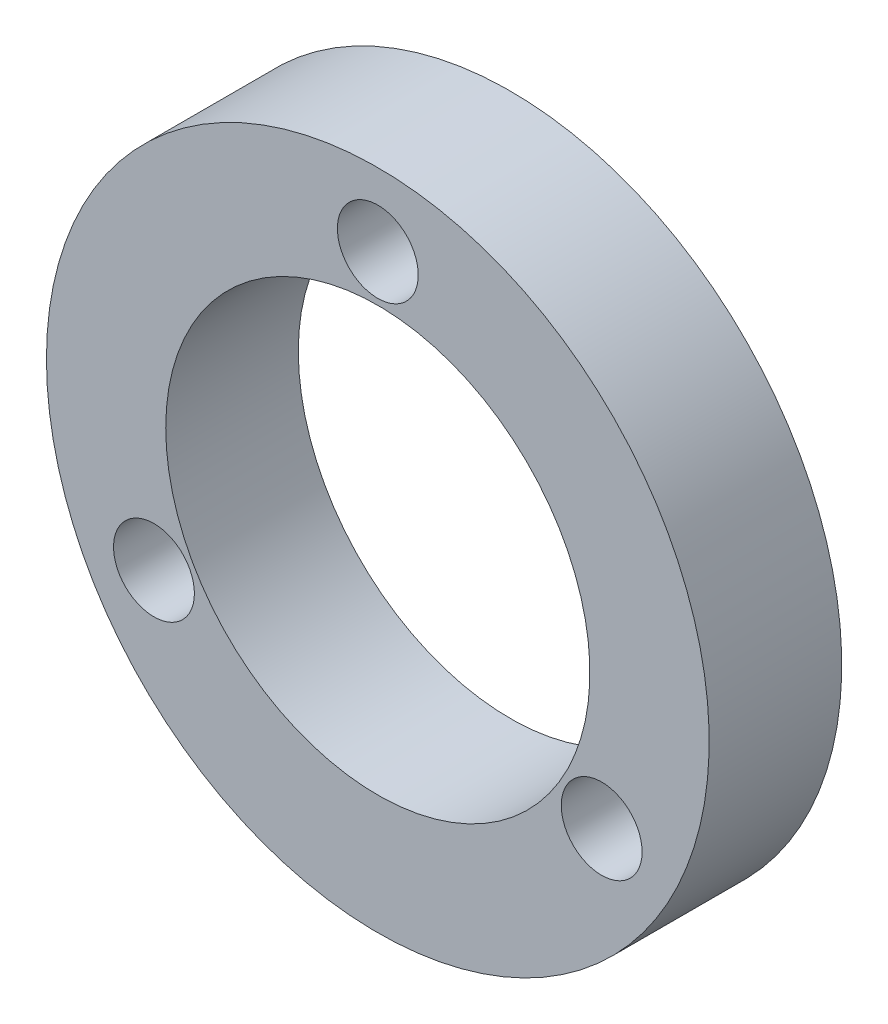
ISO-10303-21;
HEADER;
FILE_DESCRIPTION(('STEP AP214'),'2;1');
FILE_NAME('part.step','',(''),(''),'','','');
FILE_SCHEMA(('AUTOMOTIVE_DESIGN { 1 0 10303 214 1 1 1 1 }'));
ENDSEC;
DATA;
#1=APPLICATION_CONTEXT('core data for automotive mechanical design processes');
#2=APPLICATION_PROTOCOL_DEFINITION('international standard','automotive_design',2000,#1);
#3=PRODUCT_CONTEXT('',#1,'mechanical');
#4=PRODUCT('Part','Part','',(#3));
#5=PRODUCT_RELATED_PRODUCT_CATEGORY('part','',(#4));
#6=PRODUCT_DEFINITION_FORMATION('','',#4);
#7=PRODUCT_DEFINITION_CONTEXT('part definition',#1,'design');
#8=PRODUCT_DEFINITION('design','',#6,#7);
#9=PRODUCT_DEFINITION_SHAPE('','',#8);
#10=(LENGTH_UNIT() NAMED_UNIT(*) SI_UNIT(.MILLI.,.METRE.));
#11=(NAMED_UNIT(*) PLANE_ANGLE_UNIT() SI_UNIT($,.RADIAN.));
#12=(NAMED_UNIT(*) SI_UNIT($,.STERADIAN.) SOLID_ANGLE_UNIT());
#13=UNCERTAINTY_MEASURE_WITH_UNIT(LENGTH_MEASURE(1.E-05),#10,'distance_accuracy_value','');
#14=(GEOMETRIC_REPRESENTATION_CONTEXT(3) GLOBAL_UNCERTAINTY_ASSIGNED_CONTEXT((#13)) GLOBAL_UNIT_ASSIGNED_CONTEXT((#10,
#11,#12)) REPRESENTATION_CONTEXT('',''));
#15=CARTESIAN_POINT('',(0.,0.,0.));
#16=DIRECTION('',(0.,0.,1.));
#17=DIRECTION('',(1.,0.,0.));
#18=AXIS2_PLACEMENT_3D('',#15,#16,#17);
#19=CARTESIAN_POINT('',(2.22044604925031E-13,-1.11022302462516E-13,5.));
#20=DIRECTION('',(0.,0.,1.));
#21=DIRECTION('',(1.,0.,0.));
#22=AXIS2_PLACEMENT_3D('',#19,#20,#21);
#23=PLANE('',#22);
#24=CARTESIAN_POINT('',(1.11022302462516E-13,9.7499999999997,5.));
#25=DIRECTION('',(0.,0.,1.));
#26=DIRECTION('',(1.,0.,0.));
#27=AXIS2_PLACEMENT_3D('',#24,#25,#26);
#28=CIRCLE('',#27,1.525);
#29=CARTESIAN_POINT('',(1.52499999999989,9.74999999999959,5.00000000000001));
#30=VERTEX_POINT('',#29);
#31=EDGE_CURVE('E59',#30,#30,#28,.T.);
#32=ORIENTED_EDGE('',*,*,#31,.F.);
#33=EDGE_LOOP('',(#32));
#34=FACE_BOUND('',#33,.T.);
#35=CARTESIAN_POINT('',(8.44374768689904,-4.87499999999985,5.00000000000012));
#36=DIRECTION('',(0.,0.,1.));
#37=DIRECTION('',(1.,0.,0.));
#38=AXIS2_PLACEMENT_3D('',#35,#36,#37);
#39=CIRCLE('',#38,1.52500000000053);
#40=CARTESIAN_POINT('',(9.96874768689946,-4.87499999999985,5.00000000000012));
#41=VERTEX_POINT('',#40);
#42=EDGE_CURVE('E52',#41,#41,#39,.T.);
#43=ORIENTED_EDGE('',*,*,#42,.F.);
#44=EDGE_LOOP('',(#43));
#45=FACE_BOUND('',#44,.T.);
#46=CARTESIAN_POINT('',(-8.44374768689743,-4.87500000000063,5.00000000000012));
#47=DIRECTION('',(0.,0.,1.));
#48=DIRECTION('',(1.,0.,0.));
#49=AXIS2_PLACEMENT_3D('',#46,#47,#48);
#50=CIRCLE('',#49,1.52500000000079);
#51=CARTESIAN_POINT('',(-6.91874768689681,-4.87500000000052,5.00000000000012));
#52=VERTEX_POINT('',#51);
#53=EDGE_CURVE('E53',#52,#52,#50,.T.);
#54=ORIENTED_EDGE('',*,*,#53,.F.);
#55=EDGE_LOOP('',(#54));
#56=FACE_BOUND('',#55,.T.);
#57=CARTESIAN_POINT('',(2.22044604925031E-13,-1.11022302462516E-13,5.));
#58=DIRECTION('',(0.,0.,1.));
#59=DIRECTION('',(1.,0.,0.));
#60=AXIS2_PLACEMENT_3D('',#57,#58,#59);
#61=CIRCLE('',#60,12.5);
#62=CARTESIAN_POINT('',(-12.4999999999998,-1.11022302462516E-13,5.));
#63=VERTEX_POINT('',#62);
#64=EDGE_CURVE('E10',#63,#63,#61,.T.);
#65=ORIENTED_EDGE('',*,*,#64,.T.);
#66=EDGE_LOOP('',(#65));
#67=FACE_BOUND('',#66,.T.);
#68=CARTESIAN_POINT('',(2.22044604925031E-13,-1.11022302462516E-13,5.));
#69=DIRECTION('',(0.,0.,1.));
#70=DIRECTION('',(1.,0.,0.));
#71=AXIS2_PLACEMENT_3D('',#68,#69,#70);
#72=CIRCLE('',#71,8.);
#73=CARTESIAN_POINT('',(-7.99999999999978,-1.11022302462516E-13,5.));
#74=VERTEX_POINT('',#73);
#75=EDGE_CURVE('E41',#74,#74,#72,.T.);
#76=ORIENTED_EDGE('',*,*,#75,.F.);
#77=EDGE_LOOP('',(#76));
#78=FACE_BOUND('',#77,.T.);
#79=ADVANCED_FACE('F30',(#34,#45,#56,#67,#78),#23,.T.);
#80=CARTESIAN_POINT('',(0.,0.,0.));
#81=DIRECTION('',(0.,0.,1.));
#82=DIRECTION('',(1.,0.,0.));
#83=AXIS2_PLACEMENT_3D('',#80,#81,#82);
#84=PLANE('',#83);
#85=CARTESIAN_POINT('',(-1.11022302462516E-13,9.74999999999959,0.));
#86=DIRECTION('',(0.,0.,1.));
#87=DIRECTION('',(1.,0.,0.));
#88=AXIS2_PLACEMENT_3D('',#85,#86,#87);
#89=CIRCLE('',#88,1.525);
#90=CARTESIAN_POINT('',(1.52499999999989,9.74999999999959,0.));
#91=VERTEX_POINT('',#90);
#92=EDGE_CURVE('E46',#91,#91,#89,.F.);
#93=ORIENTED_EDGE('',*,*,#92,.F.);
#94=EDGE_LOOP('',(#93));
#95=FACE_BOUND('',#94,.T.);
#96=CARTESIAN_POINT('',(8.44374768689893,-4.87499999999985,1.11022302462516E-13));
#97=DIRECTION('',(0.,0.,1.));
#98=DIRECTION('',(1.,0.,0.));
#99=AXIS2_PLACEMENT_3D('',#96,#97,#98);
#100=CIRCLE('',#99,1.52500000000053);
#101=CARTESIAN_POINT('',(9.96874768689946,-4.87499999999985,1.11022302462516E-13));
#102=VERTEX_POINT('',#101);
#103=EDGE_CURVE('E56',#102,#102,#100,.F.);
#104=ORIENTED_EDGE('',*,*,#103,.F.);
#105=EDGE_LOOP('',(#104));
#106=FACE_BOUND('',#105,.T.);
#107=CARTESIAN_POINT('',(-8.44374768689759,-4.87500000000052,1.11022302462516E-13));
#108=DIRECTION('',(0.,0.,1.));
#109=DIRECTION('',(1.,0.,0.));
#110=AXIS2_PLACEMENT_3D('',#107,#108,#109);
#111=CIRCLE('',#110,1.52500000000079);
#112=CARTESIAN_POINT('',(-6.91874768689681,-4.87500000000052,1.11022302462516E-13));
#113=VERTEX_POINT('',#112);
#114=EDGE_CURVE('E49',#113,#113,#111,.F.);
#115=ORIENTED_EDGE('',*,*,#114,.F.);
#116=EDGE_LOOP('',(#115));
#117=FACE_BOUND('',#116,.T.);
#118=CARTESIAN_POINT('',(0.,0.,0.));
#119=DIRECTION('',(0.,0.,1.));
#120=DIRECTION('',(1.,0.,0.));
#121=AXIS2_PLACEMENT_3D('',#118,#119,#120);
#122=CIRCLE('',#121,12.5);
#123=CARTESIAN_POINT('',(-12.4999999999998,-1.11022302462516E-13,0.));
#124=VERTEX_POINT('',#123);
#125=EDGE_CURVE('E34',#124,#124,#122,.T.);
#126=ORIENTED_EDGE('',*,*,#125,.F.);
#127=EDGE_LOOP('',(#126));
#128=FACE_BOUND('',#127,.T.);
#129=CARTESIAN_POINT('',(0.,0.,0.));
#130=DIRECTION('',(0.,0.,1.));
#131=DIRECTION('',(1.,0.,0.));
#132=AXIS2_PLACEMENT_3D('',#129,#130,#131);
#133=CIRCLE('',#132,8.);
#134=CARTESIAN_POINT('',(-7.99999999999978,-1.11022302462516E-13,0.));
#135=VERTEX_POINT('',#134);
#136=EDGE_CURVE('E43',#135,#135,#133,.T.);
#137=ORIENTED_EDGE('',*,*,#136,.T.);
#138=EDGE_LOOP('',(#137));
#139=FACE_BOUND('',#138,.T.);
#140=ADVANCED_FACE('F72',(#95,#106,#117,#128,#139),#84,.F.);
#141=CARTESIAN_POINT('',(2.22044604925031E-13,-1.11022302462516E-13,5.));
#142=DIRECTION('',(0.,0.,-1.));
#143=DIRECTION('',(-1.,0.,0.));
#144=AXIS2_PLACEMENT_3D('',#141,#142,#143);
#145=CYLINDRICAL_SURFACE('',#144,12.5);
#146=CARTESIAN_POINT('',(-12.4999999999998,-1.11022302462516E-13,5.));
#147=CARTESIAN_POINT('',(-12.4999999999998,-1.11022302462516E-13,4.94791666666667));
#148=CARTESIAN_POINT('',(-12.4999999999998,-1.11022302462516E-13,4.89583333333334));
#149=CARTESIAN_POINT('',(-12.4999999999998,-1.11022302462516E-13,4.79166666666667));
#150=CARTESIAN_POINT('',(-12.4999999999998,-1.11022302462516E-13,4.73958333333334));
#151=CARTESIAN_POINT('',(-12.4999999999998,-1.11022302462516E-13,4.63541666666667));
#152=CARTESIAN_POINT('',(-12.4999999999998,-1.11022302462516E-13,4.58333333333334));
#153=CARTESIAN_POINT('',(-12.4999999999998,-1.11022302462516E-13,4.47916666666667));
#154=CARTESIAN_POINT('',(-12.4999999999998,-1.11022302462516E-13,4.42708333333334));
#155=CARTESIAN_POINT('',(-12.4999999999998,-1.11022302462516E-13,4.32291666666667));
#156=CARTESIAN_POINT('',(-12.4999999999998,-1.11022302462516E-13,4.27083333333334));
#157=CARTESIAN_POINT('',(-12.4999999999998,-1.11022302462516E-13,4.16666666666667));
#158=CARTESIAN_POINT('',(-12.4999999999998,-1.11022302462516E-13,4.11458333333334));
#159=CARTESIAN_POINT('',(-12.4999999999998,-1.11022302462516E-13,4.01041666666667));
#160=CARTESIAN_POINT('',(-12.4999999999998,-1.11022302462516E-13,3.95833333333334));
#161=CARTESIAN_POINT('',(-12.4999999999998,-1.11022302462516E-13,3.85416666666667));
#162=CARTESIAN_POINT('',(-12.4999999999998,-1.11022302462516E-13,3.80208333333334));
#163=CARTESIAN_POINT('',(-12.4999999999998,-1.11022302462516E-13,3.69791666666667));
#164=CARTESIAN_POINT('',(-12.4999999999998,-1.11022302462516E-13,3.64583333333334));
#165=CARTESIAN_POINT('',(-12.4999999999998,-1.11022302462516E-13,3.54166666666667));
#166=CARTESIAN_POINT('',(-12.4999999999998,-1.11022302462516E-13,3.48958333333334));
#167=CARTESIAN_POINT('',(-12.4999999999998,-1.11022302462516E-13,3.38541666666667));
#168=CARTESIAN_POINT('',(-12.4999999999998,-1.11022302462516E-13,3.33333333333334));
#169=CARTESIAN_POINT('',(-12.4999999999998,-1.11022302462516E-13,3.22916666666667));
#170=CARTESIAN_POINT('',(-12.4999999999998,-1.11022302462516E-13,3.17708333333334));
#171=CARTESIAN_POINT('',(-12.4999999999998,-1.11022302462516E-13,3.07291666666667));
#172=CARTESIAN_POINT('',(-12.4999999999998,-1.11022302462516E-13,3.02083333333334));
#173=CARTESIAN_POINT('',(-12.4999999999998,-1.11022302462516E-13,2.91666666666667));
#174=CARTESIAN_POINT('',(-12.4999999999998,-1.11022302462516E-13,2.86458333333334));
#175=CARTESIAN_POINT('',(-12.4999999999998,-1.11022302462516E-13,2.76041666666667));
#176=CARTESIAN_POINT('',(-12.4999999999998,-1.11022302462516E-13,2.70833333333333));
#177=CARTESIAN_POINT('',(-12.4999999999998,-1.11022302462516E-13,2.60416666666667));
#178=CARTESIAN_POINT('',(-12.4999999999998,-1.11022302462516E-13,2.55208333333333));
#179=CARTESIAN_POINT('',(-12.4999999999998,-1.11022302462516E-13,2.44791666666667));
#180=CARTESIAN_POINT('',(-12.4999999999998,-1.11022302462516E-13,2.39583333333333));
#181=CARTESIAN_POINT('',(-12.4999999999998,-1.11022302462516E-13,2.29166666666667));
#182=CARTESIAN_POINT('',(-12.4999999999998,-1.11022302462516E-13,2.23958333333333));
#183=CARTESIAN_POINT('',(-12.4999999999998,-1.11022302462516E-13,2.13541666666667));
#184=CARTESIAN_POINT('',(-12.4999999999998,-1.11022302462516E-13,2.08333333333333));
#185=CARTESIAN_POINT('',(-12.4999999999998,-1.11022302462516E-13,1.97916666666667));
#186=CARTESIAN_POINT('',(-12.4999999999998,-1.11022302462516E-13,1.92708333333333));
#187=CARTESIAN_POINT('',(-12.4999999999998,-1.11022302462516E-13,1.82291666666667));
#188=CARTESIAN_POINT('',(-12.4999999999998,-1.11022302462516E-13,1.77083333333333));
#189=CARTESIAN_POINT('',(-12.4999999999998,-1.11022302462516E-13,1.66666666666667));
#190=CARTESIAN_POINT('',(-12.4999999999998,-1.11022302462516E-13,1.61458333333333));
#191=CARTESIAN_POINT('',(-12.4999999999998,-1.11022302462516E-13,1.51041666666667));
#192=CARTESIAN_POINT('',(-12.4999999999998,-1.11022302462516E-13,1.45833333333333));
#193=CARTESIAN_POINT('',(-12.4999999999998,-1.11022302462516E-13,1.35416666666667));
#194=CARTESIAN_POINT('',(-12.4999999999998,-1.11022302462516E-13,1.30208333333333));
#195=CARTESIAN_POINT('',(-12.4999999999998,-1.11022302462516E-13,1.19791666666667));
#196=CARTESIAN_POINT('',(-12.4999999999998,-1.11022302462516E-13,1.14583333333333));
#197=CARTESIAN_POINT('',(-12.4999999999998,-1.11022302462516E-13,1.04166666666667));
#198=CARTESIAN_POINT('',(-12.4999999999998,-1.11022302462516E-13,0.989583333333333));
#199=CARTESIAN_POINT('',(-12.4999999999998,-1.11022302462516E-13,0.885416666666666));
#200=CARTESIAN_POINT('',(-12.4999999999998,-1.11022302462516E-13,0.833333333333333));
#201=CARTESIAN_POINT('',(-12.4999999999998,-1.11022302462516E-13,0.729166666666666));
#202=CARTESIAN_POINT('',(-12.4999999999998,-1.11022302462516E-13,0.677083333333332));
#203=CARTESIAN_POINT('',(-12.4999999999998,-1.11022302462516E-13,0.572916666666666));
#204=CARTESIAN_POINT('',(-12.4999999999998,-1.11022302462516E-13,0.520833333333332));
#205=CARTESIAN_POINT('',(-12.4999999999998,-1.11022302462516E-13,0.416666666666665));
#206=CARTESIAN_POINT('',(-12.4999999999998,-1.11022302462516E-13,0.364583333333332));
#207=CARTESIAN_POINT('',(-12.4999999999998,-1.11022302462516E-13,0.260416666666665));
#208=CARTESIAN_POINT('',(-12.4999999999998,-1.11022302462516E-13,0.208333333333332));
#209=CARTESIAN_POINT('',(-12.4999999999998,-1.11022302462516E-13,0.104166666666665));
#210=CARTESIAN_POINT('',(-12.4999999999998,-1.11022302462516E-13,0.0520833333333322));
#211=CARTESIAN_POINT('',(-12.4999999999998,-1.11022302462516E-13,0.));
#212=B_SPLINE_CURVE_WITH_KNOTS('',3,(#146,#147,#148,#149,#150,#151,#152,#153,#154,#155,#156,
#157,#158,#159,#160,#161,#162,#163,#164,#165,#166,#167,#168,#169,#170,#171,#172,#173,#174,#175,
#176,#177,#178,#179,#180,#181,#182,#183,#184,#185,#186,#187,#188,#189,#190,#191,#192,#193,#194,
#195,#196,#197,#198,#199,#200,#201,#202,#203,#204,#205,#206,#207,#208,#209,#210,#211),
.UNSPECIFIED.,.F.,.F.,(4,2,2,2,2,2,2,2,2,2,2,2,2,2,2,2,2,2,2,2,2,2,2,2,2,2,2,2,2,2,2,2,4),(0.,
0.156249999999999,0.312499999999999,0.46875,0.625,0.781250000000001,0.9375,1.09375,1.25,1.40625,
1.5625,1.71875,1.875,2.03125,2.1875,2.34375,2.5,2.65625,2.8125,2.96875,3.125,3.28125,3.4375,
3.59375,3.75,3.90625,4.0625,4.21875,4.375,4.53125000000001,4.68750000000001,4.84375000000001,
5.),.UNSPECIFIED.);
#213=EDGE_CURVE('BSEAM32',#63,#124,#212,.T.);
#214=ORIENTED_EDGE('',*,*,#64,.F.);
#215=ORIENTED_EDGE('',*,*,#125,.T.);
#216=ORIENTED_EDGE('',*,*,#213,.T.);
#217=ORIENTED_EDGE('',*,*,#213,.F.);
#218=EDGE_LOOP('',(#214,#216,#215,#217));
#219=FACE_BOUND('',#218,.T.);
#220=ADVANCED_FACE('F32',(#219),#145,.T.);
#221=CARTESIAN_POINT('',(2.22044604925031E-13,-1.11022302462516E-13,5.));
#222=DIRECTION('',(0.,0.,-1.));
#223=DIRECTION('',(-1.,0.,0.));
#224=AXIS2_PLACEMENT_3D('',#221,#222,#223);
#225=CYLINDRICAL_SURFACE('',#224,8.);
#226=CARTESIAN_POINT('',(-7.99999999999978,-1.11022302462516E-13,5.));
#227=CARTESIAN_POINT('',(-7.99999999999978,-1.11022302462516E-13,4.94791666666667));
#228=CARTESIAN_POINT('',(-7.99999999999978,-1.11022302462516E-13,4.89583333333334));
#229=CARTESIAN_POINT('',(-7.99999999999978,-1.11022302462516E-13,4.79166666666667));
#230=CARTESIAN_POINT('',(-7.99999999999978,-1.11022302462516E-13,4.73958333333334));
#231=CARTESIAN_POINT('',(-7.99999999999978,-1.11022302462516E-13,4.63541666666667));
#232=CARTESIAN_POINT('',(-7.99999999999978,-1.11022302462516E-13,4.58333333333334));
#233=CARTESIAN_POINT('',(-7.99999999999978,-1.11022302462516E-13,4.47916666666667));
#234=CARTESIAN_POINT('',(-7.99999999999978,-1.11022302462516E-13,4.42708333333334));
#235=CARTESIAN_POINT('',(-7.99999999999978,-1.11022302462516E-13,4.32291666666667));
#236=CARTESIAN_POINT('',(-7.99999999999978,-1.11022302462516E-13,4.27083333333334));
#237=CARTESIAN_POINT('',(-7.99999999999978,-1.11022302462516E-13,4.16666666666667));
#238=CARTESIAN_POINT('',(-7.99999999999978,-1.11022302462516E-13,4.11458333333334));
#239=CARTESIAN_POINT('',(-7.99999999999978,-1.11022302462516E-13,4.01041666666667));
#240=CARTESIAN_POINT('',(-7.99999999999978,-1.11022302462516E-13,3.95833333333334));
#241=CARTESIAN_POINT('',(-7.99999999999978,-1.11022302462516E-13,3.85416666666667));
#242=CARTESIAN_POINT('',(-7.99999999999978,-1.11022302462516E-13,3.80208333333334));
#243=CARTESIAN_POINT('',(-7.99999999999978,-1.11022302462516E-13,3.69791666666667));
#244=CARTESIAN_POINT('',(-7.99999999999978,-1.11022302462516E-13,3.64583333333334));
#245=CARTESIAN_POINT('',(-7.99999999999978,-1.11022302462516E-13,3.54166666666667));
#246=CARTESIAN_POINT('',(-7.99999999999978,-1.11022302462516E-13,3.48958333333334));
#247=CARTESIAN_POINT('',(-7.99999999999978,-1.11022302462516E-13,3.38541666666667));
#248=CARTESIAN_POINT('',(-7.99999999999978,-1.11022302462516E-13,3.33333333333334));
#249=CARTESIAN_POINT('',(-7.99999999999978,-1.11022302462516E-13,3.22916666666667));
#250=CARTESIAN_POINT('',(-7.99999999999978,-1.11022302462516E-13,3.17708333333334));
#251=CARTESIAN_POINT('',(-7.99999999999978,-1.11022302462516E-13,3.07291666666667));
#252=CARTESIAN_POINT('',(-7.99999999999978,-1.11022302462516E-13,3.02083333333333));
#253=CARTESIAN_POINT('',(-7.99999999999978,-1.11022302462516E-13,2.91666666666667));
#254=CARTESIAN_POINT('',(-7.99999999999978,-1.11022302462516E-13,2.86458333333333));
#255=CARTESIAN_POINT('',(-7.99999999999978,-1.11022302462516E-13,2.76041666666667));
#256=CARTESIAN_POINT('',(-7.99999999999978,-1.11022302462516E-13,2.70833333333333));
#257=CARTESIAN_POINT('',(-7.99999999999978,-1.11022302462516E-13,2.60416666666667));
#258=CARTESIAN_POINT('',(-7.99999999999978,-1.11022302462516E-13,2.55208333333333));
#259=CARTESIAN_POINT('',(-7.99999999999978,-1.11022302462516E-13,2.44791666666667));
#260=CARTESIAN_POINT('',(-7.99999999999978,-1.11022302462516E-13,2.39583333333333));
#261=CARTESIAN_POINT('',(-7.99999999999978,-1.11022302462516E-13,2.29166666666667));
#262=CARTESIAN_POINT('',(-7.99999999999978,-1.11022302462516E-13,2.23958333333333));
#263=CARTESIAN_POINT('',(-7.99999999999978,-1.11022302462516E-13,2.13541666666667));
#264=CARTESIAN_POINT('',(-7.99999999999978,-1.11022302462516E-13,2.08333333333333));
#265=CARTESIAN_POINT('',(-7.99999999999978,-1.11022302462516E-13,1.97916666666667));
#266=CARTESIAN_POINT('',(-7.99999999999978,-1.11022302462516E-13,1.92708333333333));
#267=CARTESIAN_POINT('',(-7.99999999999978,-1.11022302462516E-13,1.82291666666667));
#268=CARTESIAN_POINT('',(-7.99999999999978,-1.11022302462516E-13,1.77083333333333));
#269=CARTESIAN_POINT('',(-7.99999999999978,-1.11022302462516E-13,1.66666666666667));
#270=CARTESIAN_POINT('',(-7.99999999999978,-1.11022302462516E-13,1.61458333333333));
#271=CARTESIAN_POINT('',(-7.99999999999978,-1.11022302462516E-13,1.51041666666667));
#272=CARTESIAN_POINT('',(-7.99999999999978,-1.11022302462516E-13,1.45833333333333));
#273=CARTESIAN_POINT('',(-7.99999999999978,-1.11022302462516E-13,1.35416666666667));
#274=CARTESIAN_POINT('',(-7.99999999999978,-1.11022302462516E-13,1.30208333333333));
#275=CARTESIAN_POINT('',(-7.99999999999978,-1.11022302462516E-13,1.19791666666667));
#276=CARTESIAN_POINT('',(-7.99999999999978,-1.11022302462516E-13,1.14583333333333));
#277=CARTESIAN_POINT('',(-7.99999999999978,-1.11022302462516E-13,1.04166666666667));
#278=CARTESIAN_POINT('',(-7.99999999999978,-1.11022302462516E-13,0.989583333333333));
#279=CARTESIAN_POINT('',(-7.99999999999978,-1.11022302462516E-13,0.885416666666667));
#280=CARTESIAN_POINT('',(-7.99999999999978,-1.11022302462516E-13,0.833333333333333));
#281=CARTESIAN_POINT('',(-7.99999999999978,-1.11022302462516E-13,0.729166666666666));
#282=CARTESIAN_POINT('',(-7.99999999999978,-1.11022302462516E-13,0.677083333333332));
#283=CARTESIAN_POINT('',(-7.99999999999978,-1.11022302462516E-13,0.572916666666666));
#284=CARTESIAN_POINT('',(-7.99999999999978,-1.11022302462516E-13,0.520833333333332));
#285=CARTESIAN_POINT('',(-7.99999999999978,-1.11022302462516E-13,0.416666666666665));
#286=CARTESIAN_POINT('',(-7.99999999999978,-1.11022302462516E-13,0.364583333333332));
#287=CARTESIAN_POINT('',(-7.99999999999978,-1.11022302462516E-13,0.260416666666665));
#288=CARTESIAN_POINT('',(-7.99999999999978,-1.11022302462516E-13,0.208333333333332));
#289=CARTESIAN_POINT('',(-7.99999999999978,-1.11022302462516E-13,0.104166666666665));
#290=CARTESIAN_POINT('',(-7.99999999999978,-1.11022302462516E-13,0.0520833333333322));
#291=CARTESIAN_POINT('',(-7.99999999999978,-1.11022302462516E-13,0.));
#292=B_SPLINE_CURVE_WITH_KNOTS('',3,(#226,#227,#228,#229,#230,#231,#232,#233,#234,#235,#236,
#237,#238,#239,#240,#241,#242,#243,#244,#245,#246,#247,#248,#249,#250,#251,#252,#253,#254,#255,
#256,#257,#258,#259,#260,#261,#262,#263,#264,#265,#266,#267,#268,#269,#270,#271,#272,#273,#274,
#275,#276,#277,#278,#279,#280,#281,#282,#283,#284,#285,#286,#287,#288,#289,#290,#291),
.UNSPECIFIED.,.F.,.F.,(4,2,2,2,2,2,2,2,2,2,2,2,2,2,2,2,2,2,2,2,2,2,2,2,2,2,2,2,2,2,2,2,4),(0.,
0.156250000000001,0.312500000000001,0.468750000000001,0.625000000000001,0.781250000000002,
0.937500000000002,1.09375,1.25,1.40625,1.5625,1.71875,1.875,2.03125,2.1875,2.34375,2.5,2.65625,
2.8125,2.96875,3.125,3.28125,3.4375,3.59375,3.75,3.90625,4.0625,4.21875,4.37500000000001,
4.53125000000001,4.68750000000001,4.84375000000001,5.00000000000001),.UNSPECIFIED.);
#293=EDGE_CURVE('BSEAM80',#74,#135,#292,.T.);
#294=ORIENTED_EDGE('',*,*,#75,.T.);
#295=ORIENTED_EDGE('',*,*,#136,.F.);
#296=ORIENTED_EDGE('',*,*,#293,.T.);
#297=ORIENTED_EDGE('',*,*,#293,.F.);
#298=EDGE_LOOP('',(#294,#296,#295,#297));
#299=FACE_BOUND('',#298,.T.);
#300=ADVANCED_FACE('F80',(#299),#225,.F.);
#301=CARTESIAN_POINT('',(-8.44374768689759,-4.87500000000052,-0.000999999999917733));
#302=DIRECTION('',(0.,0.,1.));
#303=DIRECTION('',(1.,0.,0.));
#304=AXIS2_PLACEMENT_3D('',#301,#302,#303);
#305=CYLINDRICAL_SURFACE('',#304,1.52500000000079);
#306=CARTESIAN_POINT('',(-6.91874768689681,-4.87500000000052,5.00000000000012));
#307=CARTESIAN_POINT('',(-6.91874768689681,-4.87500000000052,4.94791666666678));
#308=CARTESIAN_POINT('',(-6.91874768689681,-4.87500000000052,4.89583333333345));
#309=CARTESIAN_POINT('',(-6.91874768689681,-4.87500000000052,4.79166666666678));
#310=CARTESIAN_POINT('',(-6.91874768689681,-4.87500000000052,4.73958333333345));
#311=CARTESIAN_POINT('',(-6.91874768689681,-4.87500000000052,4.63541666666678));
#312=CARTESIAN_POINT('',(-6.91874768689681,-4.87500000000052,4.58333333333345));
#313=CARTESIAN_POINT('',(-6.91874768689681,-4.87500000000052,4.47916666666678));
#314=CARTESIAN_POINT('',(-6.91874768689681,-4.87500000000052,4.42708333333345));
#315=CARTESIAN_POINT('',(-6.91874768689681,-4.87500000000052,4.32291666666678));
#316=CARTESIAN_POINT('',(-6.91874768689681,-4.87500000000052,4.27083333333345));
#317=CARTESIAN_POINT('',(-6.91874768689681,-4.87500000000052,4.16666666666678));
#318=CARTESIAN_POINT('',(-6.91874768689681,-4.87500000000052,4.11458333333345));
#319=CARTESIAN_POINT('',(-6.91874768689681,-4.87500000000052,4.01041666666678));
#320=CARTESIAN_POINT('',(-6.91874768689681,-4.87500000000052,3.95833333333345));
#321=CARTESIAN_POINT('',(-6.91874768689681,-4.87500000000052,3.85416666666678));
#322=CARTESIAN_POINT('',(-6.91874768689681,-4.87500000000052,3.80208333333345));
#323=CARTESIAN_POINT('',(-6.91874768689681,-4.87500000000052,3.69791666666678));
#324=CARTESIAN_POINT('',(-6.91874768689681,-4.87500000000052,3.64583333333345));
#325=CARTESIAN_POINT('',(-6.91874768689681,-4.87500000000052,3.54166666666678));
#326=CARTESIAN_POINT('',(-6.91874768689681,-4.87500000000052,3.48958333333345));
#327=CARTESIAN_POINT('',(-6.91874768689681,-4.87500000000052,3.38541666666678));
#328=CARTESIAN_POINT('',(-6.91874768689681,-4.87500000000052,3.33333333333345));
#329=CARTESIAN_POINT('',(-6.91874768689681,-4.87500000000052,3.22916666666678));
#330=CARTESIAN_POINT('',(-6.91874768689681,-4.87500000000052,3.17708333333345));
#331=CARTESIAN_POINT('',(-6.91874768689681,-4.87500000000052,3.07291666666678));
#332=CARTESIAN_POINT('',(-6.91874768689681,-4.87500000000052,3.02083333333345));
#333=CARTESIAN_POINT('',(-6.91874768689681,-4.87500000000052,2.91666666666678));
#334=CARTESIAN_POINT('',(-6.91874768689681,-4.87500000000052,2.86458333333345));
#335=CARTESIAN_POINT('',(-6.91874768689681,-4.87500000000052,2.76041666666678));
#336=CARTESIAN_POINT('',(-6.91874768689681,-4.87500000000052,2.70833333333345));
#337=CARTESIAN_POINT('',(-6.91874768689681,-4.87500000000052,2.60416666666678));
#338=CARTESIAN_POINT('',(-6.91874768689681,-4.87500000000052,2.55208333333345));
#339=CARTESIAN_POINT('',(-6.91874768689681,-4.87500000000052,2.44791666666678));
#340=CARTESIAN_POINT('',(-6.91874768689681,-4.87500000000052,2.39583333333345));
#341=CARTESIAN_POINT('',(-6.91874768689681,-4.87500000000052,2.29166666666678));
#342=CARTESIAN_POINT('',(-6.91874768689681,-4.87500000000052,2.23958333333345));
#343=CARTESIAN_POINT('',(-6.91874768689681,-4.87500000000052,2.13541666666678));
#344=CARTESIAN_POINT('',(-6.91874768689681,-4.87500000000052,2.08333333333345));
#345=CARTESIAN_POINT('',(-6.91874768689681,-4.87500000000052,1.97916666666678));
#346=CARTESIAN_POINT('',(-6.91874768689681,-4.87500000000052,1.92708333333345));
#347=CARTESIAN_POINT('',(-6.91874768689681,-4.87500000000052,1.82291666666678));
#348=CARTESIAN_POINT('',(-6.91874768689681,-4.87500000000052,1.77083333333345));
#349=CARTESIAN_POINT('',(-6.91874768689681,-4.87500000000052,1.66666666666678));
#350=CARTESIAN_POINT('',(-6.91874768689681,-4.87500000000052,1.61458333333345));
#351=CARTESIAN_POINT('',(-6.91874768689681,-4.87500000000052,1.51041666666678));
#352=CARTESIAN_POINT('',(-6.91874768689681,-4.87500000000052,1.45833333333345));
#353=CARTESIAN_POINT('',(-6.91874768689681,-4.87500000000052,1.35416666666678));
#354=CARTESIAN_POINT('',(-6.91874768689681,-4.87500000000052,1.30208333333345));
#355=CARTESIAN_POINT('',(-6.91874768689681,-4.87500000000052,1.19791666666678));
#356=CARTESIAN_POINT('',(-6.91874768689681,-4.87500000000052,1.14583333333345));
#357=CARTESIAN_POINT('',(-6.91874768689681,-4.87500000000052,1.04166666666678));
#358=CARTESIAN_POINT('',(-6.91874768689681,-4.87500000000052,0.989583333333446));
#359=CARTESIAN_POINT('',(-6.91874768689681,-4.87500000000052,0.885416666666779));
#360=CARTESIAN_POINT('',(-6.91874768689681,-4.87500000000052,0.833333333333446));
#361=CARTESIAN_POINT('',(-6.91874768689681,-4.87500000000052,0.729166666666779));
#362=CARTESIAN_POINT('',(-6.91874768689681,-4.87500000000052,0.677083333333445));
#363=CARTESIAN_POINT('',(-6.91874768689681,-4.87500000000052,0.572916666666778));
#364=CARTESIAN_POINT('',(-6.91874768689681,-4.87500000000052,0.520833333333445));
#365=CARTESIAN_POINT('',(-6.91874768689681,-4.87500000000052,0.416666666666778));
#366=CARTESIAN_POINT('',(-6.91874768689681,-4.87500000000052,0.364583333333445));
#367=CARTESIAN_POINT('',(-6.91874768689681,-4.87500000000052,0.260416666666778));
#368=CARTESIAN_POINT('',(-6.91874768689681,-4.87500000000052,0.208333333333444));
#369=CARTESIAN_POINT('',(-6.91874768689681,-4.87500000000052,0.104166666666778));
#370=CARTESIAN_POINT('',(-6.91874768689681,-4.87500000000052,0.0520833333334444));
#371=CARTESIAN_POINT('',(-6.91874768689681,-4.87500000000052,1.11021878946042E-13));
#372=B_SPLINE_CURVE_WITH_KNOTS('',3,(#306,#307,#308,#309,#310,#311,#312,#313,#314,#315,#316,
#317,#318,#319,#320,#321,#322,#323,#324,#325,#326,#327,#328,#329,#330,#331,#332,#333,#334,#335,
#336,#337,#338,#339,#340,#341,#342,#343,#344,#345,#346,#347,#348,#349,#350,#351,#352,#353,#354,
#355,#356,#357,#358,#359,#360,#361,#362,#363,#364,#365,#366,#367,#368,#369,#370,#371),
.UNSPECIFIED.,.F.,.F.,(4,2,2,2,2,2,2,2,2,2,2,2,2,2,2,2,2,2,2,2,2,2,2,2,2,2,2,2,2,2,2,2,4),(0.,
0.156249999999999,0.312499999999999,0.46875,0.625,0.781250000000001,0.937500000000001,1.09375,
1.25,1.40625,1.5625,1.71875,1.875,2.03125,2.1875,2.34375,2.5,2.65625,2.8125,2.96875,3.125,
3.28125,3.4375,3.59375,3.75,3.90625,4.0625,4.21875,4.37500000000001,4.53125000000001,
4.68750000000001,4.84375000000001,5.00000000000001),.UNSPECIFIED.);
#373=EDGE_CURVE('BSEAM83',#52,#113,#372,.T.);
#374=ORIENTED_EDGE('',*,*,#53,.T.);
#375=ORIENTED_EDGE('',*,*,#114,.T.);
#376=ORIENTED_EDGE('',*,*,#373,.T.);
#377=ORIENTED_EDGE('',*,*,#373,.F.);
#378=EDGE_LOOP('',(#374,#376,#375,#377));
#379=FACE_BOUND('',#378,.T.);
#380=ADVANCED_FACE('F83',(#379),#305,.F.);
#381=CARTESIAN_POINT('',(8.44374768689893,-4.87499999999985,-0.000999999999917733));
#382=DIRECTION('',(0.,0.,1.));
#383=DIRECTION('',(1.,0.,0.));
#384=AXIS2_PLACEMENT_3D('',#381,#382,#383);
#385=CYLINDRICAL_SURFACE('',#384,1.52500000000053);
#386=CARTESIAN_POINT('',(9.96874768689946,-4.87499999999985,5.00000000000012));
#387=CARTESIAN_POINT('',(9.96874768689946,-4.87499999999985,4.94791666666678));
#388=CARTESIAN_POINT('',(9.96874768689946,-4.87499999999985,4.89583333333345));
#389=CARTESIAN_POINT('',(9.96874768689946,-4.87499999999985,4.79166666666678));
#390=CARTESIAN_POINT('',(9.96874768689946,-4.87499999999985,4.73958333333345));
#391=CARTESIAN_POINT('',(9.96874768689946,-4.87499999999985,4.63541666666678));
#392=CARTESIAN_POINT('',(9.96874768689946,-4.87499999999985,4.58333333333345));
#393=CARTESIAN_POINT('',(9.96874768689946,-4.87499999999985,4.47916666666678));
#394=CARTESIAN_POINT('',(9.96874768689946,-4.87499999999985,4.42708333333345));
#395=CARTESIAN_POINT('',(9.96874768689946,-4.87499999999985,4.32291666666678));
#396=CARTESIAN_POINT('',(9.96874768689946,-4.87499999999985,4.27083333333345));
#397=CARTESIAN_POINT('',(9.96874768689946,-4.87499999999985,4.16666666666678));
#398=CARTESIAN_POINT('',(9.96874768689946,-4.87499999999985,4.11458333333345));
#399=CARTESIAN_POINT('',(9.96874768689946,-4.87499999999985,4.01041666666678));
#400=CARTESIAN_POINT('',(9.96874768689946,-4.87499999999985,3.95833333333345));
#401=CARTESIAN_POINT('',(9.96874768689946,-4.87499999999985,3.85416666666678));
#402=CARTESIAN_POINT('',(9.96874768689946,-4.87499999999985,3.80208333333345));
#403=CARTESIAN_POINT('',(9.96874768689946,-4.87499999999985,3.69791666666678));
#404=CARTESIAN_POINT('',(9.96874768689946,-4.87499999999985,3.64583333333345));
#405=CARTESIAN_POINT('',(9.96874768689946,-4.87499999999985,3.54166666666678));
#406=CARTESIAN_POINT('',(9.96874768689946,-4.87499999999985,3.48958333333345));
#407=CARTESIAN_POINT('',(9.96874768689946,-4.87499999999985,3.38541666666678));
#408=CARTESIAN_POINT('',(9.96874768689946,-4.87499999999985,3.33333333333345));
#409=CARTESIAN_POINT('',(9.96874768689946,-4.87499999999985,3.22916666666678));
#410=CARTESIAN_POINT('',(9.96874768689946,-4.87499999999985,3.17708333333345));
#411=CARTESIAN_POINT('',(9.96874768689946,-4.87499999999985,3.07291666666678));
#412=CARTESIAN_POINT('',(9.96874768689946,-4.87499999999985,3.02083333333345));
#413=CARTESIAN_POINT('',(9.96874768689946,-4.87499999999985,2.91666666666678));
#414=CARTESIAN_POINT('',(9.96874768689946,-4.87499999999985,2.86458333333345));
#415=CARTESIAN_POINT('',(9.96874768689946,-4.87499999999985,2.76041666666678));
#416=CARTESIAN_POINT('',(9.96874768689946,-4.87499999999985,2.70833333333345));
#417=CARTESIAN_POINT('',(9.96874768689946,-4.87499999999985,2.60416666666678));
#418=CARTESIAN_POINT('',(9.96874768689946,-4.87499999999985,2.55208333333345));
#419=CARTESIAN_POINT('',(9.96874768689946,-4.87499999999985,2.44791666666678));
#420=CARTESIAN_POINT('',(9.96874768689946,-4.87499999999985,2.39583333333345));
#421=CARTESIAN_POINT('',(9.96874768689946,-4.87499999999985,2.29166666666678));
#422=CARTESIAN_POINT('',(9.96874768689946,-4.87499999999985,2.23958333333345));
#423=CARTESIAN_POINT('',(9.96874768689946,-4.87499999999985,2.13541666666678));
#424=CARTESIAN_POINT('',(9.96874768689946,-4.87499999999985,2.08333333333345));
#425=CARTESIAN_POINT('',(9.96874768689946,-4.87499999999985,1.97916666666678));
#426=CARTESIAN_POINT('',(9.96874768689946,-4.87499999999985,1.92708333333345));
#427=CARTESIAN_POINT('',(9.96874768689946,-4.87499999999985,1.82291666666678));
#428=CARTESIAN_POINT('',(9.96874768689946,-4.87499999999985,1.77083333333345));
#429=CARTESIAN_POINT('',(9.96874768689946,-4.87499999999985,1.66666666666678));
#430=CARTESIAN_POINT('',(9.96874768689946,-4.87499999999985,1.61458333333345));
#431=CARTESIAN_POINT('',(9.96874768689946,-4.87499999999985,1.51041666666678));
#432=CARTESIAN_POINT('',(9.96874768689946,-4.87499999999985,1.45833333333345));
#433=CARTESIAN_POINT('',(9.96874768689946,-4.87499999999985,1.35416666666678));
#434=CARTESIAN_POINT('',(9.96874768689946,-4.87499999999985,1.30208333333345));
#435=CARTESIAN_POINT('',(9.96874768689946,-4.87499999999985,1.19791666666678));
#436=CARTESIAN_POINT('',(9.96874768689946,-4.87499999999985,1.14583333333345));
#437=CARTESIAN_POINT('',(9.96874768689946,-4.87499999999985,1.04166666666678));
#438=CARTESIAN_POINT('',(9.96874768689946,-4.87499999999985,0.989583333333446));
#439=CARTESIAN_POINT('',(9.96874768689946,-4.87499999999985,0.885416666666779));
#440=CARTESIAN_POINT('',(9.96874768689946,-4.87499999999985,0.833333333333446));
#441=CARTESIAN_POINT('',(9.96874768689946,-4.87499999999985,0.729166666666779));
#442=CARTESIAN_POINT('',(9.96874768689946,-4.87499999999985,0.677083333333445));
#443=CARTESIAN_POINT('',(9.96874768689946,-4.87499999999985,0.572916666666778));
#444=CARTESIAN_POINT('',(9.96874768689946,-4.87499999999985,0.520833333333445));
#445=CARTESIAN_POINT('',(9.96874768689946,-4.87499999999985,0.416666666666778));
#446=CARTESIAN_POINT('',(9.96874768689946,-4.87499999999985,0.364583333333445));
#447=CARTESIAN_POINT('',(9.96874768689946,-4.87499999999985,0.260416666666778));
#448=CARTESIAN_POINT('',(9.96874768689946,-4.87499999999985,0.208333333333444));
#449=CARTESIAN_POINT('',(9.96874768689946,-4.87499999999985,0.104166666666778));
#450=CARTESIAN_POINT('',(9.96874768689946,-4.87499999999985,0.0520833333334444));
#451=CARTESIAN_POINT('',(9.96874768689946,-4.87499999999985,1.11021878946042E-13));
#452=B_SPLINE_CURVE_WITH_KNOTS('',3,(#386,#387,#388,#389,#390,#391,#392,#393,#394,#395,#396,
#397,#398,#399,#400,#401,#402,#403,#404,#405,#406,#407,#408,#409,#410,#411,#412,#413,#414,#415,
#416,#417,#418,#419,#420,#421,#422,#423,#424,#425,#426,#427,#428,#429,#430,#431,#432,#433,#434,
#435,#436,#437,#438,#439,#440,#441,#442,#443,#444,#445,#446,#447,#448,#449,#450,#451),
.UNSPECIFIED.,.F.,.F.,(4,2,2,2,2,2,2,2,2,2,2,2,2,2,2,2,2,2,2,2,2,2,2,2,2,2,2,2,2,2,2,2,4),(0.,
0.156249999999999,0.312499999999999,0.46875,0.625,0.781250000000001,0.937500000000001,1.09375,
1.25,1.40625,1.5625,1.71875,1.875,2.03125,2.1875,2.34375,2.5,2.65625,2.8125,2.96875,3.125,
3.28125,3.4375,3.59375,3.75,3.90625,4.0625,4.21875,4.37500000000001,4.53125000000001,
4.68750000000001,4.84375000000001,5.00000000000001),.UNSPECIFIED.);
#453=EDGE_CURVE('BSEAM98',#41,#102,#452,.T.);
#454=ORIENTED_EDGE('',*,*,#42,.T.);
#455=ORIENTED_EDGE('',*,*,#103,.T.);
#456=ORIENTED_EDGE('',*,*,#453,.T.);
#457=ORIENTED_EDGE('',*,*,#453,.F.);
#458=EDGE_LOOP('',(#454,#456,#455,#457));
#459=FACE_BOUND('',#458,.T.);
#460=ADVANCED_FACE('F98',(#459),#385,.F.);
#461=CARTESIAN_POINT('',(-1.11022302462516E-13,9.74999999999959,-0.00100000000002876));
#462=DIRECTION('',(0.,0.,1.));
#463=DIRECTION('',(1.,0.,0.));
#464=AXIS2_PLACEMENT_3D('',#461,#462,#463);
#465=CYLINDRICAL_SURFACE('',#464,1.525);
#466=CARTESIAN_POINT('',(1.52499999999989,9.74999999999959,5.00000000000001));
#467=CARTESIAN_POINT('',(1.52499999999989,9.74999999999959,4.94791666666667));
#468=CARTESIAN_POINT('',(1.52499999999989,9.74999999999959,4.89583333333334));
#469=CARTESIAN_POINT('',(1.52499999999989,9.74999999999959,4.79166666666667));
#470=CARTESIAN_POINT('',(1.52499999999989,9.74999999999959,4.73958333333334));
#471=CARTESIAN_POINT('',(1.52499999999989,9.74999999999959,4.63541666666667));
#472=CARTESIAN_POINT('',(1.52499999999989,9.74999999999959,4.58333333333334));
#473=CARTESIAN_POINT('',(1.52499999999989,9.74999999999959,4.47916666666667));
#474=CARTESIAN_POINT('',(1.52499999999989,9.74999999999959,4.42708333333334));
#475=CARTESIAN_POINT('',(1.52499999999989,9.74999999999959,4.32291666666667));
#476=CARTESIAN_POINT('',(1.52499999999989,9.74999999999959,4.27083333333334));
#477=CARTESIAN_POINT('',(1.52499999999989,9.74999999999959,4.16666666666667));
#478=CARTESIAN_POINT('',(1.52499999999989,9.74999999999959,4.11458333333334));
#479=CARTESIAN_POINT('',(1.52499999999989,9.74999999999959,4.01041666666667));
#480=CARTESIAN_POINT('',(1.52499999999989,9.74999999999959,3.95833333333334));
#481=CARTESIAN_POINT('',(1.52499999999989,9.74999999999959,3.85416666666667));
#482=CARTESIAN_POINT('',(1.52499999999989,9.74999999999959,3.80208333333334));
#483=CARTESIAN_POINT('',(1.52499999999989,9.74999999999959,3.69791666666667));
#484=CARTESIAN_POINT('',(1.52499999999989,9.74999999999959,3.64583333333334));
#485=CARTESIAN_POINT('',(1.52499999999989,9.74999999999959,3.54166666666667));
#486=CARTESIAN_POINT('',(1.52499999999989,9.74999999999959,3.48958333333334));
#487=CARTESIAN_POINT('',(1.52499999999989,9.74999999999959,3.38541666666667));
#488=CARTESIAN_POINT('',(1.52499999999989,9.74999999999959,3.33333333333334));
#489=CARTESIAN_POINT('',(1.52499999999989,9.74999999999959,3.22916666666667));
#490=CARTESIAN_POINT('',(1.52499999999989,9.74999999999959,3.17708333333334));
#491=CARTESIAN_POINT('',(1.52499999999989,9.74999999999959,3.07291666666667));
#492=CARTESIAN_POINT('',(1.52499999999989,9.74999999999959,3.02083333333334));
#493=CARTESIAN_POINT('',(1.52499999999989,9.74999999999959,2.91666666666667));
#494=CARTESIAN_POINT('',(1.52499999999989,9.74999999999959,2.86458333333334));
#495=CARTESIAN_POINT('',(1.52499999999989,9.74999999999959,2.76041666666667));
#496=CARTESIAN_POINT('',(1.52499999999989,9.74999999999959,2.70833333333334));
#497=CARTESIAN_POINT('',(1.52499999999989,9.74999999999959,2.60416666666667));
#498=CARTESIAN_POINT('',(1.52499999999989,9.74999999999959,2.55208333333334));
#499=CARTESIAN_POINT('',(1.52499999999989,9.74999999999959,2.44791666666667));
#500=CARTESIAN_POINT('',(1.52499999999989,9.74999999999959,2.39583333333334));
#501=CARTESIAN_POINT('',(1.52499999999989,9.74999999999959,2.29166666666667));
#502=CARTESIAN_POINT('',(1.52499999999989,9.74999999999959,2.23958333333334));
#503=CARTESIAN_POINT('',(1.52499999999989,9.74999999999959,2.13541666666667));
#504=CARTESIAN_POINT('',(1.52499999999989,9.74999999999959,2.08333333333334));
#505=CARTESIAN_POINT('',(1.52499999999989,9.74999999999959,1.97916666666667));
#506=CARTESIAN_POINT('',(1.52499999999989,9.74999999999959,1.92708333333334));
#507=CARTESIAN_POINT('',(1.52499999999989,9.74999999999959,1.82291666666667));
#508=CARTESIAN_POINT('',(1.52499999999989,9.74999999999959,1.77083333333334));
#509=CARTESIAN_POINT('',(1.52499999999989,9.74999999999959,1.66666666666667));
#510=CARTESIAN_POINT('',(1.52499999999989,9.74999999999959,1.61458333333334));
#511=CARTESIAN_POINT('',(1.52499999999989,9.74999999999959,1.51041666666667));
#512=CARTESIAN_POINT('',(1.52499999999989,9.74999999999959,1.45833333333333));
#513=CARTESIAN_POINT('',(1.52499999999989,9.74999999999959,1.35416666666667));
#514=CARTESIAN_POINT('',(1.52499999999989,9.74999999999959,1.30208333333333));
#515=CARTESIAN_POINT('',(1.52499999999989,9.74999999999959,1.19791666666667));
#516=CARTESIAN_POINT('',(1.52499999999989,9.74999999999959,1.14583333333333));
#517=CARTESIAN_POINT('',(1.52499999999989,9.74999999999959,1.04166666666667));
#518=CARTESIAN_POINT('',(1.52499999999989,9.74999999999959,0.989583333333335));
#519=CARTESIAN_POINT('',(1.52499999999989,9.74999999999959,0.885416666666668));
#520=CARTESIAN_POINT('',(1.52499999999989,9.74999999999959,0.833333333333335));
#521=CARTESIAN_POINT('',(1.52499999999989,9.74999999999959,0.729166666666668));
#522=CARTESIAN_POINT('',(1.52499999999989,9.74999999999959,0.677083333333334));
#523=CARTESIAN_POINT('',(1.52499999999989,9.74999999999959,0.572916666666667));
#524=CARTESIAN_POINT('',(1.52499999999989,9.74999999999959,0.520833333333334));
#525=CARTESIAN_POINT('',(1.52499999999989,9.74999999999959,0.416666666666667));
#526=CARTESIAN_POINT('',(1.52499999999989,9.74999999999959,0.364583333333333));
#527=CARTESIAN_POINT('',(1.52499999999989,9.74999999999959,0.260416666666667));
#528=CARTESIAN_POINT('',(1.52499999999989,9.74999999999959,0.208333333333333));
#529=CARTESIAN_POINT('',(1.52499999999989,9.74999999999959,0.104166666666667));
#530=CARTESIAN_POINT('',(1.52499999999989,9.74999999999959,0.0520833333333334));
#531=CARTESIAN_POINT('',(1.52499999999989,9.74999999999959,0.));
#532=B_SPLINE_CURVE_WITH_KNOTS('',3,(#466,#467,#468,#469,#470,#471,#472,#473,#474,#475,#476,
#477,#478,#479,#480,#481,#482,#483,#484,#485,#486,#487,#488,#489,#490,#491,#492,#493,#494,#495,
#496,#497,#498,#499,#500,#501,#502,#503,#504,#505,#506,#507,#508,#509,#510,#511,#512,#513,#514,
#515,#516,#517,#518,#519,#520,#521,#522,#523,#524,#525,#526,#527,#528,#529,#530,#531),
.UNSPECIFIED.,.F.,.F.,(4,2,2,2,2,2,2,2,2,2,2,2,2,2,2,2,2,2,2,2,2,2,2,2,2,2,2,2,2,2,2,2,4),(0.,
0.156249999999999,0.312499999999999,0.46875,0.625,0.781250000000001,0.937500000000001,1.09375,
1.25,1.40625,1.5625,1.71875,1.875,2.03125,2.1875,2.34375,2.5,2.65625,2.8125,2.96875,3.125,
3.28125,3.4375,3.59375,3.75,3.90625,4.0625,4.21875,4.37500000000001,4.53125000000001,
4.68750000000001,4.84375000000001,5.00000000000001),.UNSPECIFIED.);
#533=EDGE_CURVE('BSEAM67',#30,#91,#532,.T.);
#534=ORIENTED_EDGE('',*,*,#31,.T.);
#535=ORIENTED_EDGE('',*,*,#92,.T.);
#536=ORIENTED_EDGE('',*,*,#533,.T.);
#537=ORIENTED_EDGE('',*,*,#533,.F.);
#538=EDGE_LOOP('',(#534,#536,#535,#537));
#539=FACE_BOUND('',#538,.T.);
#540=ADVANCED_FACE('F67',(#539),#465,.F.);
#541=CLOSED_SHELL('',(#79,#140,#220,#300,#380,#460,#540));
#542=MANIFOLD_SOLID_BREP('B2',#541);
#543=ADVANCED_BREP_SHAPE_REPRESENTATION('',(#18,#542),#14);
#544=SHAPE_DEFINITION_REPRESENTATION(#9,#543);
ENDSEC;
END-ISO-10303-21;
